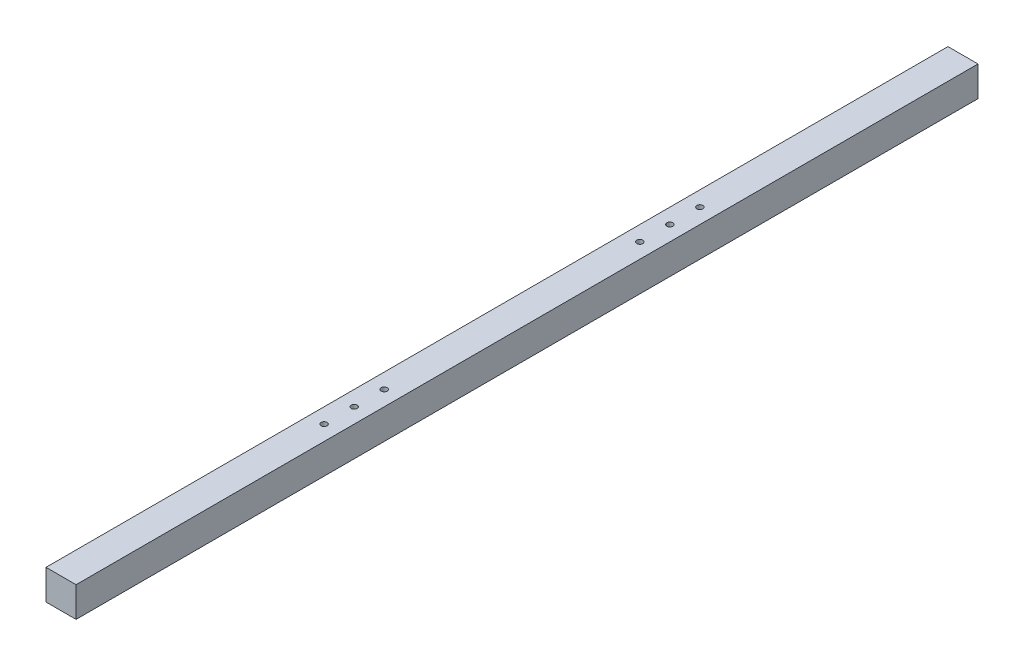
ISO-10303-21;
HEADER;
FILE_DESCRIPTION(('STEP AP214'),'2;1');
FILE_NAME('part.step','',(''),(''),'','','');
FILE_SCHEMA(('AUTOMOTIVE_DESIGN { 1 0 10303 214 1 1 1 1 }'));
ENDSEC;
DATA;
#1=APPLICATION_CONTEXT('core data for automotive mechanical design processes');
#2=APPLICATION_PROTOCOL_DEFINITION('international standard','automotive_design',2000,#1);
#3=PRODUCT_CONTEXT('',#1,'mechanical');
#4=PRODUCT('Part','Part','',(#3));
#5=PRODUCT_RELATED_PRODUCT_CATEGORY('part','',(#4));
#6=PRODUCT_DEFINITION_FORMATION('','',#4);
#7=PRODUCT_DEFINITION_CONTEXT('part definition',#1,'design');
#8=PRODUCT_DEFINITION('design','',#6,#7);
#9=PRODUCT_DEFINITION_SHAPE('','',#8);
#10=(LENGTH_UNIT() NAMED_UNIT(*) SI_UNIT(.MILLI.,.METRE.));
#11=(NAMED_UNIT(*) PLANE_ANGLE_UNIT() SI_UNIT($,.RADIAN.));
#12=(NAMED_UNIT(*) SI_UNIT($,.STERADIAN.) SOLID_ANGLE_UNIT());
#13=UNCERTAINTY_MEASURE_WITH_UNIT(LENGTH_MEASURE(1.E-05),#10,'distance_accuracy_value','');
#14=(GEOMETRIC_REPRESENTATION_CONTEXT(3) GLOBAL_UNCERTAINTY_ASSIGNED_CONTEXT((#13)) GLOBAL_UNIT_ASSIGNED_CONTEXT((#10,
#11,#12)) REPRESENTATION_CONTEXT('',''));
#15=CARTESIAN_POINT('',(0.,0.,0.));
#16=DIRECTION('',(0.,0.,1.));
#17=DIRECTION('',(1.,0.,0.));
#18=AXIS2_PLACEMENT_3D('',#15,#16,#17);
#19=CARTESIAN_POINT('',(10.,10.,600.));
#20=DIRECTION('',(-1.,0.,0.));
#21=DIRECTION('',(0.,0.,1.));
#22=AXIS2_PLACEMENT_3D('',#19,#20,#21);
#23=PLANE('',#22);
#24=DIRECTION('',(0.,1.,0.));
#25=VECTOR('',#24,1.);
#26=CARTESIAN_POINT('',(10.,10.,0.));
#27=LINE('',#26,#25);
#28=CARTESIAN_POINT('',(10.,-10.,0.));
#29=VERTEX_POINT('',#28);
#30=CARTESIAN_POINT('',(10.,10.,0.));
#31=VERTEX_POINT('',#30);
#32=EDGE_CURVE('E100',#29,#31,#27,.T.);
#33=ORIENTED_EDGE('',*,*,#32,.T.);
#34=DIRECTION('',(0.,0.,-1.));
#35=VECTOR('',#34,1.);
#36=CARTESIAN_POINT('',(10.,10.,600.));
#37=LINE('',#36,#35);
#38=CARTESIAN_POINT('',(10.,10.,600.));
#39=VERTEX_POINT('',#38);
#40=EDGE_CURVE('E11',#39,#31,#37,.T.);
#41=ORIENTED_EDGE('',*,*,#40,.F.);
#42=DIRECTION('',(0.,1.,0.));
#43=VECTOR('',#42,1.);
#44=CARTESIAN_POINT('',(10.,10.,600.));
#45=LINE('',#44,#43);
#46=CARTESIAN_POINT('',(10.,-10.,600.));
#47=VERTEX_POINT('',#46);
#48=EDGE_CURVE('E88',#47,#39,#45,.T.);
#49=ORIENTED_EDGE('',*,*,#48,.F.);
#50=DIRECTION('',(0.,0.,-1.));
#51=VECTOR('',#50,1.);
#52=CARTESIAN_POINT('',(10.,-10.,600.));
#53=LINE('',#52,#51);
#54=EDGE_CURVE('E96',#47,#29,#53,.T.);
#55=ORIENTED_EDGE('',*,*,#54,.T.);
#56=EDGE_LOOP('',(#33,#41,#49,#55));
#57=FACE_BOUND('',#56,.T.);
#58=ADVANCED_FACE('F37',(#57),#23,.F.);
#59=CARTESIAN_POINT('',(-10.,10.,600.));
#60=DIRECTION('',(0.,-1.,0.));
#61=DIRECTION('',(0.,0.,-1.));
#62=AXIS2_PLACEMENT_3D('',#59,#60,#61);
#63=PLANE('',#62);
#64=CARTESIAN_POINT('',(0.,10.,425.));
#65=DIRECTION('',(0.,-1.,0.));
#66=DIRECTION('',(0.,0.,-1.));
#67=AXIS2_PLACEMENT_3D('',#64,#65,#66);
#68=CIRCLE('',#67,2.);
#69=CARTESIAN_POINT('',(0.,10.,423.));
#70=VERTEX_POINT('',#69);
#71=EDGE_CURVE('E103',#70,#70,#68,.T.);
#72=ORIENTED_EDGE('',*,*,#71,.T.);
#73=EDGE_LOOP('',(#72));
#74=FACE_BOUND('',#73,.T.);
#75=CARTESIAN_POINT('',(0.,10.,405.));
#76=DIRECTION('',(0.,-1.,0.));
#77=DIRECTION('',(0.,0.,-1.));
#78=AXIS2_PLACEMENT_3D('',#75,#76,#77);
#79=CIRCLE('',#78,2.);
#80=CARTESIAN_POINT('',(0.,10.,403.));
#81=VERTEX_POINT('',#80);
#82=EDGE_CURVE('E116',#81,#81,#79,.T.);
#83=ORIENTED_EDGE('',*,*,#82,.T.);
#84=EDGE_LOOP('',(#83));
#85=FACE_BOUND('',#84,.T.);
#86=CARTESIAN_POINT('',(0.,10.,385.));
#87=DIRECTION('',(0.,-1.,0.));
#88=DIRECTION('',(0.,0.,-1.));
#89=AXIS2_PLACEMENT_3D('',#86,#87,#88);
#90=CIRCLE('',#89,2.);
#91=CARTESIAN_POINT('',(0.,10.,383.));
#92=VERTEX_POINT('',#91);
#93=EDGE_CURVE('E119',#92,#92,#90,.T.);
#94=ORIENTED_EDGE('',*,*,#93,.T.);
#95=EDGE_LOOP('',(#94));
#96=FACE_BOUND('',#95,.T.);
#97=CARTESIAN_POINT('',(0.,10.,215.));
#98=DIRECTION('',(0.,-1.,0.));
#99=DIRECTION('',(0.,0.,-1.));
#100=AXIS2_PLACEMENT_3D('',#97,#98,#99);
#101=CIRCLE('',#100,2.);
#102=CARTESIAN_POINT('',(0.,10.,213.));
#103=VERTEX_POINT('',#102);
#104=EDGE_CURVE('E122',#103,#103,#101,.T.);
#105=ORIENTED_EDGE('',*,*,#104,.T.);
#106=EDGE_LOOP('',(#105));
#107=FACE_BOUND('',#106,.T.);
#108=CARTESIAN_POINT('',(0.,10.,175.));
#109=DIRECTION('',(0.,-1.,0.));
#110=DIRECTION('',(0.,0.,-1.));
#111=AXIS2_PLACEMENT_3D('',#108,#109,#110);
#112=CIRCLE('',#111,2.);
#113=CARTESIAN_POINT('',(0.,10.,173.));
#114=VERTEX_POINT('',#113);
#115=EDGE_CURVE('E125',#114,#114,#112,.T.);
#116=ORIENTED_EDGE('',*,*,#115,.T.);
#117=EDGE_LOOP('',(#116));
#118=FACE_BOUND('',#117,.T.);
#119=CARTESIAN_POINT('',(0.,10.,195.));
#120=DIRECTION('',(0.,-1.,0.));
#121=DIRECTION('',(0.,0.,-1.));
#122=AXIS2_PLACEMENT_3D('',#119,#120,#121);
#123=CIRCLE('',#122,2.);
#124=CARTESIAN_POINT('',(0.,10.,193.));
#125=VERTEX_POINT('',#124);
#126=EDGE_CURVE('E128',#125,#125,#123,.T.);
#127=ORIENTED_EDGE('',*,*,#126,.T.);
#128=EDGE_LOOP('',(#127));
#129=FACE_BOUND('',#128,.T.);
#130=DIRECTION('',(-1.,0.,0.));
#131=VECTOR('',#130,1.);
#132=CARTESIAN_POINT('',(-10.,10.,0.));
#133=LINE('',#132,#131);
#134=CARTESIAN_POINT('',(-10.,10.,0.));
#135=VERTEX_POINT('',#134);
#136=EDGE_CURVE('E92',#31,#135,#133,.T.);
#137=ORIENTED_EDGE('',*,*,#136,.T.);
#138=DIRECTION('',(0.,0.,-1.));
#139=VECTOR('',#138,1.);
#140=CARTESIAN_POINT('',(-10.,10.,600.));
#141=LINE('',#140,#139);
#142=CARTESIAN_POINT('',(-10.,10.,600.));
#143=VERTEX_POINT('',#142);
#144=EDGE_CURVE('E45',#143,#135,#141,.T.);
#145=ORIENTED_EDGE('',*,*,#144,.F.);
#146=DIRECTION('',(-1.,0.,0.));
#147=VECTOR('',#146,1.);
#148=CARTESIAN_POINT('',(-10.,10.,600.));
#149=LINE('',#148,#147);
#150=EDGE_CURVE('E83',#39,#143,#149,.T.);
#151=ORIENTED_EDGE('',*,*,#150,.F.);
#152=ORIENTED_EDGE('',*,*,#40,.T.);
#153=EDGE_LOOP('',(#137,#145,#151,#152));
#154=FACE_BOUND('',#153,.T.);
#155=ADVANCED_FACE('F91',(#74,#85,#96,#107,#118,#129,#154),#63,.F.);
#156=CARTESIAN_POINT('',(-10.,10.,600.));
#157=DIRECTION('',(1.,0.,0.));
#158=DIRECTION('',(0.,0.,-1.));
#159=AXIS2_PLACEMENT_3D('',#156,#157,#158);
#160=PLANE('',#159);
#161=DIRECTION('',(0.,-1.,0.));
#162=VECTOR('',#161,1.);
#163=CARTESIAN_POINT('',(-10.,10.,0.));
#164=LINE('',#163,#162);
#165=CARTESIAN_POINT('',(-10.,-10.,0.));
#166=VERTEX_POINT('',#165);
#167=EDGE_CURVE('E70',#135,#166,#164,.T.);
#168=ORIENTED_EDGE('',*,*,#167,.T.);
#169=DIRECTION('',(0.,0.,-1.));
#170=VECTOR('',#169,1.);
#171=CARTESIAN_POINT('',(-10.,-10.,600.));
#172=LINE('',#171,#170);
#173=CARTESIAN_POINT('',(-10.,-10.,600.));
#174=VERTEX_POINT('',#173);
#175=EDGE_CURVE('E93',#174,#166,#172,.T.);
#176=ORIENTED_EDGE('',*,*,#175,.F.);
#177=DIRECTION('',(0.,-1.,0.));
#178=VECTOR('',#177,1.);
#179=CARTESIAN_POINT('',(-10.,10.,600.));
#180=LINE('',#179,#178);
#181=EDGE_CURVE('E86',#143,#174,#180,.T.);
#182=ORIENTED_EDGE('',*,*,#181,.F.);
#183=ORIENTED_EDGE('',*,*,#144,.T.);
#184=EDGE_LOOP('',(#168,#176,#182,#183));
#185=FACE_BOUND('',#184,.T.);
#186=ADVANCED_FACE('F94',(#185),#160,.F.);
#187=CARTESIAN_POINT('',(-10.,-10.,600.));
#188=DIRECTION('',(0.,1.,0.));
#189=DIRECTION('',(0.,0.,1.));
#190=AXIS2_PLACEMENT_3D('',#187,#188,#189);
#191=PLANE('',#190);
#192=CARTESIAN_POINT('',(0.,-10.,425.));
#193=DIRECTION('',(0.,1.,0.));
#194=DIRECTION('',(0.,0.,-1.));
#195=AXIS2_PLACEMENT_3D('',#192,#193,#194);
#196=CIRCLE('',#195,2.);
#197=CARTESIAN_POINT('',(0.,-10.,423.));
#198=VERTEX_POINT('',#197);
#199=EDGE_CURVE('E135',#198,#198,#196,.T.);
#200=ORIENTED_EDGE('',*,*,#199,.T.);
#201=EDGE_LOOP('',(#200));
#202=FACE_BOUND('',#201,.T.);
#203=CARTESIAN_POINT('',(0.,-10.,405.));
#204=DIRECTION('',(0.,1.,0.));
#205=DIRECTION('',(0.,0.,-1.));
#206=AXIS2_PLACEMENT_3D('',#203,#204,#205);
#207=CIRCLE('',#206,2.);
#208=CARTESIAN_POINT('',(0.,-10.,403.));
#209=VERTEX_POINT('',#208);
#210=EDGE_CURVE('E138',#209,#209,#207,.T.);
#211=ORIENTED_EDGE('',*,*,#210,.T.);
#212=EDGE_LOOP('',(#211));
#213=FACE_BOUND('',#212,.T.);
#214=CARTESIAN_POINT('',(0.,-10.,385.));
#215=DIRECTION('',(0.,1.,0.));
#216=DIRECTION('',(0.,0.,-1.));
#217=AXIS2_PLACEMENT_3D('',#214,#215,#216);
#218=CIRCLE('',#217,2.);
#219=CARTESIAN_POINT('',(0.,-10.,383.));
#220=VERTEX_POINT('',#219);
#221=EDGE_CURVE('E141',#220,#220,#218,.T.);
#222=ORIENTED_EDGE('',*,*,#221,.T.);
#223=EDGE_LOOP('',(#222));
#224=FACE_BOUND('',#223,.T.);
#225=CARTESIAN_POINT('',(0.,-10.,215.));
#226=DIRECTION('',(0.,1.,0.));
#227=DIRECTION('',(0.,0.,1.));
#228=AXIS2_PLACEMENT_3D('',#225,#226,#227);
#229=CIRCLE('',#228,2.);
#230=CARTESIAN_POINT('',(0.,-10.,217.));
#231=VERTEX_POINT('',#230);
#232=EDGE_CURVE('E144',#231,#231,#229,.T.);
#233=ORIENTED_EDGE('',*,*,#232,.T.);
#234=EDGE_LOOP('',(#233));
#235=FACE_BOUND('',#234,.T.);
#236=CARTESIAN_POINT('',(0.,-10.,175.));
#237=DIRECTION('',(0.,1.,0.));
#238=DIRECTION('',(0.,0.,1.));
#239=AXIS2_PLACEMENT_3D('',#236,#237,#238);
#240=CIRCLE('',#239,2.);
#241=CARTESIAN_POINT('',(0.,-10.,177.));
#242=VERTEX_POINT('',#241);
#243=EDGE_CURVE('E134',#242,#242,#240,.T.);
#244=ORIENTED_EDGE('',*,*,#243,.T.);
#245=EDGE_LOOP('',(#244));
#246=FACE_BOUND('',#245,.T.);
#247=CARTESIAN_POINT('',(0.,-10.,195.));
#248=DIRECTION('',(0.,1.,0.));
#249=DIRECTION('',(0.,0.,1.));
#250=AXIS2_PLACEMENT_3D('',#247,#248,#249);
#251=CIRCLE('',#250,2.);
#252=CARTESIAN_POINT('',(0.,-10.,197.));
#253=VERTEX_POINT('',#252);
#254=EDGE_CURVE('E131',#253,#253,#251,.T.);
#255=ORIENTED_EDGE('',*,*,#254,.T.);
#256=EDGE_LOOP('',(#255));
#257=FACE_BOUND('',#256,.T.);
#258=DIRECTION('',(1.,0.,0.));
#259=VECTOR('',#258,1.);
#260=CARTESIAN_POINT('',(-10.,-10.,0.));
#261=LINE('',#260,#259);
#262=EDGE_CURVE('E76',#166,#29,#261,.T.);
#263=ORIENTED_EDGE('',*,*,#262,.T.);
#264=ORIENTED_EDGE('',*,*,#54,.F.);
#265=DIRECTION('',(1.,0.,0.));
#266=VECTOR('',#265,1.);
#267=CARTESIAN_POINT('',(-10.,-10.,600.));
#268=LINE('',#267,#266);
#269=EDGE_CURVE('E53',#174,#47,#268,.T.);
#270=ORIENTED_EDGE('',*,*,#269,.F.);
#271=ORIENTED_EDGE('',*,*,#175,.T.);
#272=EDGE_LOOP('',(#263,#264,#270,#271));
#273=FACE_BOUND('',#272,.T.);
#274=ADVANCED_FACE('F108',(#202,#213,#224,#235,#246,#257,#273),#191,.F.);
#275=CARTESIAN_POINT('',(0.,0.,600.));
#276=DIRECTION('',(0.,0.,1.));
#277=DIRECTION('',(1.,0.,0.));
#278=AXIS2_PLACEMENT_3D('',#275,#276,#277);
#279=PLANE('',#278);
#280=ORIENTED_EDGE('',*,*,#48,.T.);
#281=ORIENTED_EDGE('',*,*,#150,.T.);
#282=ORIENTED_EDGE('',*,*,#181,.T.);
#283=ORIENTED_EDGE('',*,*,#269,.T.);
#284=EDGE_LOOP('',(#280,#281,#282,#283));
#285=FACE_BOUND('',#284,.T.);
#286=ADVANCED_FACE('F84',(#285),#279,.T.);
#287=CARTESIAN_POINT('',(0.,0.,0.));
#288=DIRECTION('',(0.,0.,1.));
#289=DIRECTION('',(1.,0.,0.));
#290=AXIS2_PLACEMENT_3D('',#287,#288,#289);
#291=PLANE('',#290);
#292=ORIENTED_EDGE('',*,*,#32,.F.);
#293=ORIENTED_EDGE('',*,*,#262,.F.);
#294=ORIENTED_EDGE('',*,*,#167,.F.);
#295=ORIENTED_EDGE('',*,*,#136,.F.);
#296=EDGE_LOOP('',(#292,#293,#294,#295));
#297=FACE_BOUND('',#296,.T.);
#298=ADVANCED_FACE('F111',(#297),#291,.F.);
#299=CARTESIAN_POINT('',(0.,-10.,195.));
#300=DIRECTION('',(0.,1.,0.));
#301=DIRECTION('',(0.,0.,1.));
#302=AXIS2_PLACEMENT_3D('',#299,#300,#301);
#303=CYLINDRICAL_SURFACE('',#302,2.);
#304=ORIENTED_EDGE('',*,*,#254,.F.);
#305=EDGE_LOOP('',(#304));
#306=FACE_BOUND('',#305,.T.);
#307=ORIENTED_EDGE('',*,*,#126,.F.);
#308=EDGE_LOOP('',(#307));
#309=FACE_BOUND('',#308,.T.);
#310=ADVANCED_FACE('F156',(#306,#309),#303,.F.);
#311=CARTESIAN_POINT('',(0.,-10.,175.));
#312=DIRECTION('',(0.,1.,0.));
#313=DIRECTION('',(0.,0.,1.));
#314=AXIS2_PLACEMENT_3D('',#311,#312,#313);
#315=CYLINDRICAL_SURFACE('',#314,2.);
#316=ORIENTED_EDGE('',*,*,#243,.F.);
#317=EDGE_LOOP('',(#316));
#318=FACE_BOUND('',#317,.T.);
#319=ORIENTED_EDGE('',*,*,#115,.F.);
#320=EDGE_LOOP('',(#319));
#321=FACE_BOUND('',#320,.T.);
#322=ADVANCED_FACE('F152',(#318,#321),#315,.F.);
#323=CARTESIAN_POINT('',(0.,-10.,215.));
#324=DIRECTION('',(0.,1.,0.));
#325=DIRECTION('',(0.,0.,1.));
#326=AXIS2_PLACEMENT_3D('',#323,#324,#325);
#327=CYLINDRICAL_SURFACE('',#326,2.);
#328=ORIENTED_EDGE('',*,*,#232,.F.);
#329=EDGE_LOOP('',(#328));
#330=FACE_BOUND('',#329,.T.);
#331=ORIENTED_EDGE('',*,*,#104,.F.);
#332=EDGE_LOOP('',(#331));
#333=FACE_BOUND('',#332,.T.);
#334=ADVANCED_FACE('F155',(#330,#333),#327,.F.);
#335=CARTESIAN_POINT('',(0.,-10.,385.));
#336=DIRECTION('',(0.,1.,0.));
#337=DIRECTION('',(0.,0.,1.));
#338=AXIS2_PLACEMENT_3D('',#335,#336,#337);
#339=CYLINDRICAL_SURFACE('',#338,2.);
#340=ORIENTED_EDGE('',*,*,#221,.F.);
#341=EDGE_LOOP('',(#340));
#342=FACE_BOUND('',#341,.T.);
#343=ORIENTED_EDGE('',*,*,#93,.F.);
#344=EDGE_LOOP('',(#343));
#345=FACE_BOUND('',#344,.T.);
#346=ADVANCED_FACE('F229',(#342,#345),#339,.F.);
#347=CARTESIAN_POINT('',(0.,-10.,405.));
#348=DIRECTION('',(0.,1.,0.));
#349=DIRECTION('',(0.,0.,1.));
#350=AXIS2_PLACEMENT_3D('',#347,#348,#349);
#351=CYLINDRICAL_SURFACE('',#350,2.);
#352=ORIENTED_EDGE('',*,*,#210,.F.);
#353=EDGE_LOOP('',(#352));
#354=FACE_BOUND('',#353,.T.);
#355=ORIENTED_EDGE('',*,*,#82,.F.);
#356=EDGE_LOOP('',(#355));
#357=FACE_BOUND('',#356,.T.);
#358=ADVANCED_FACE('F238',(#354,#357),#351,.F.);
#359=CARTESIAN_POINT('',(0.,-10.,425.));
#360=DIRECTION('',(0.,1.,0.));
#361=DIRECTION('',(0.,0.,1.));
#362=AXIS2_PLACEMENT_3D('',#359,#360,#361);
#363=CYLINDRICAL_SURFACE('',#362,2.);
#364=ORIENTED_EDGE('',*,*,#199,.F.);
#365=EDGE_LOOP('',(#364));
#366=FACE_BOUND('',#365,.T.);
#367=ORIENTED_EDGE('',*,*,#71,.F.);
#368=EDGE_LOOP('',(#367));
#369=FACE_BOUND('',#368,.T.);
#370=ADVANCED_FACE('F247',(#366,#369),#363,.F.);
#371=CLOSED_SHELL('',(#58,#155,#186,#274,#286,#298,#310,#322,#334,#346,#358,#370));
#372=MANIFOLD_SOLID_BREP('B2',#371);
#373=ADVANCED_BREP_SHAPE_REPRESENTATION('',(#18,#372),#14);
#374=SHAPE_DEFINITION_REPRESENTATION(#9,#373);
ENDSEC;
END-ISO-10303-21;
